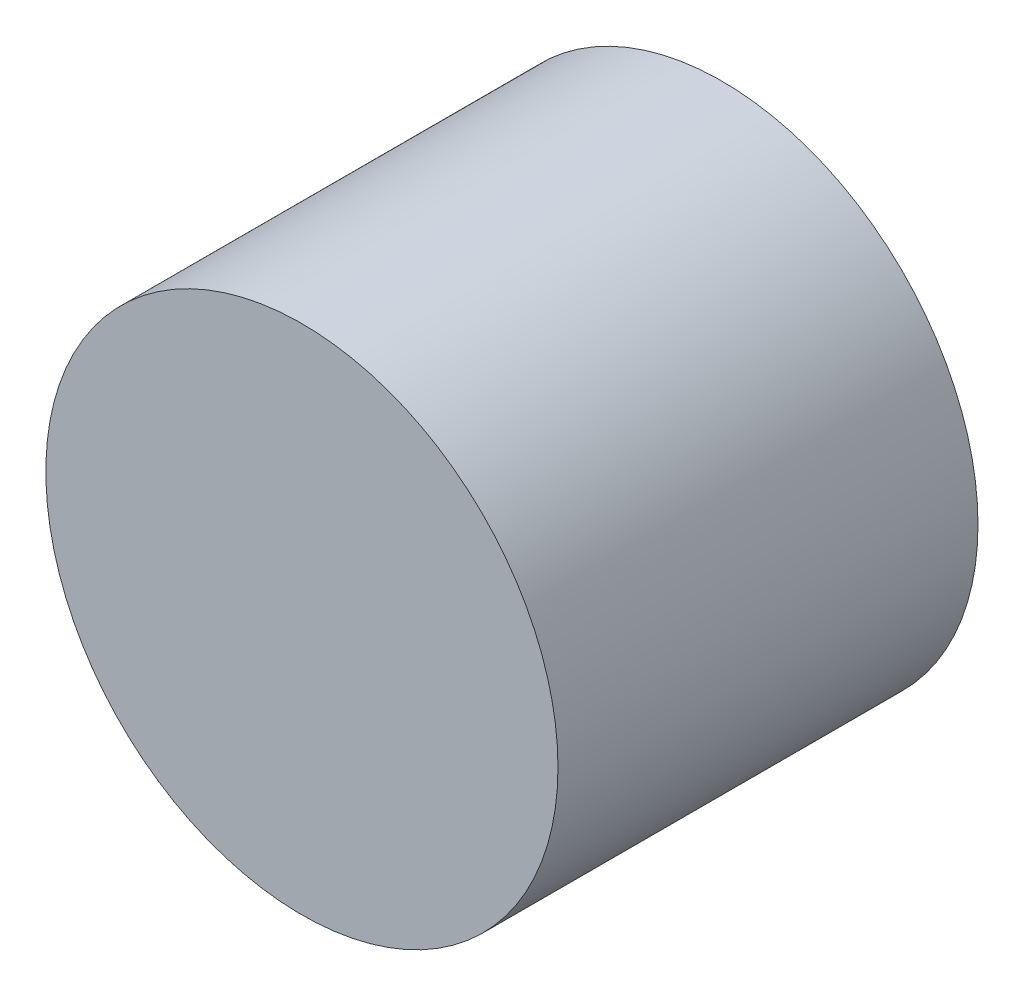
ISO-10303-21;
HEADER;
FILE_DESCRIPTION(('STEP AP214'),'2;1');
FILE_NAME('part.step','',(''),(''),'','','');
FILE_SCHEMA(('AUTOMOTIVE_DESIGN { 1 0 10303 214 1 1 1 1 }'));
ENDSEC;
DATA;
#1=APPLICATION_CONTEXT('core data for automotive mechanical design processes');
#2=APPLICATION_PROTOCOL_DEFINITION('international standard','automotive_design',2000,#1);
#3=PRODUCT_CONTEXT('',#1,'mechanical');
#4=PRODUCT('Part','Part','',(#3));
#5=PRODUCT_RELATED_PRODUCT_CATEGORY('part','',(#4));
#6=PRODUCT_DEFINITION_FORMATION('','',#4);
#7=PRODUCT_DEFINITION_CONTEXT('part definition',#1,'design');
#8=PRODUCT_DEFINITION('design','',#6,#7);
#9=PRODUCT_DEFINITION_SHAPE('','',#8);
#10=(LENGTH_UNIT() NAMED_UNIT(*) SI_UNIT(.MILLI.,.METRE.));
#11=(NAMED_UNIT(*) PLANE_ANGLE_UNIT() SI_UNIT($,.RADIAN.));
#12=(NAMED_UNIT(*) SI_UNIT($,.STERADIAN.) SOLID_ANGLE_UNIT());
#13=UNCERTAINTY_MEASURE_WITH_UNIT(LENGTH_MEASURE(1.E-05),#10,'distance_accuracy_value','');
#14=(GEOMETRIC_REPRESENTATION_CONTEXT(3) GLOBAL_UNCERTAINTY_ASSIGNED_CONTEXT((#13)) GLOBAL_UNIT_ASSIGNED_CONTEXT((#10,
#11,#12)) REPRESENTATION_CONTEXT('',''));
#15=CARTESIAN_POINT('',(0.,0.,0.));
#16=DIRECTION('',(0.,0.,1.));
#17=DIRECTION('',(1.,0.,0.));
#18=AXIS2_PLACEMENT_3D('',#15,#16,#17);
#19=CARTESIAN_POINT('',(0.,0.,16.));
#20=DIRECTION('',(0.,0.,-1.));
#21=DIRECTION('',(-1.,0.,0.));
#22=AXIS2_PLACEMENT_3D('',#19,#20,#21);
#23=CYLINDRICAL_SURFACE('',#22,9.755);
#24=CARTESIAN_POINT('',(0.,0.,16.));
#25=DIRECTION('',(0.,0.,1.));
#26=DIRECTION('',(1.,0.,0.));
#27=AXIS2_PLACEMENT_3D('',#24,#25,#26);
#28=CIRCLE('',#27,9.755);
#29=CARTESIAN_POINT('',(9.755,0.,16.));
#30=VERTEX_POINT('',#29);
#31=EDGE_CURVE('E10',#30,#30,#28,.T.);
#32=ORIENTED_EDGE('',*,*,#31,.F.);
#33=EDGE_LOOP('',(#32));
#34=FACE_BOUND('',#33,.T.);
#35=CARTESIAN_POINT('',(0.,0.,0.));
#36=DIRECTION('',(0.,0.,1.));
#37=DIRECTION('',(1.,0.,0.));
#38=AXIS2_PLACEMENT_3D('',#35,#36,#37);
#39=CIRCLE('',#38,9.755);
#40=CARTESIAN_POINT('',(9.755,0.,0.));
#41=VERTEX_POINT('',#40);
#42=EDGE_CURVE('E40',#41,#41,#39,.T.);
#43=ORIENTED_EDGE('',*,*,#42,.T.);
#44=EDGE_LOOP('',(#43));
#45=FACE_BOUND('',#44,.T.);
#46=ADVANCED_FACE('F37',(#34,#45),#23,.T.);
#47=CARTESIAN_POINT('',(0.,0.,16.));
#48=DIRECTION('',(0.,0.,1.));
#49=DIRECTION('',(1.,0.,0.));
#50=AXIS2_PLACEMENT_3D('',#47,#48,#49);
#51=PLANE('',#50);
#52=ORIENTED_EDGE('',*,*,#31,.T.);
#53=EDGE_LOOP('',(#52));
#54=FACE_BOUND('',#53,.T.);
#55=ADVANCED_FACE('F52',(#54),#51,.T.);
#56=CARTESIAN_POINT('',(0.,0.,0.));
#57=DIRECTION('',(0.,0.,1.));
#58=DIRECTION('',(1.,0.,0.));
#59=AXIS2_PLACEMENT_3D('',#56,#57,#58);
#60=PLANE('',#59);
#61=ORIENTED_EDGE('',*,*,#42,.F.);
#62=EDGE_LOOP('',(#61));
#63=FACE_BOUND('',#62,.T.);
#64=ADVANCED_FACE('F50',(#63),#60,.F.);
#65=CLOSED_SHELL('',(#46,#55,#64));
#66=MANIFOLD_SOLID_BREP('B2',#65);
#67=ADVANCED_BREP_SHAPE_REPRESENTATION('',(#18,#66),#14);
#68=SHAPE_DEFINITION_REPRESENTATION(#9,#67);
ENDSEC;
END-ISO-10303-21;
